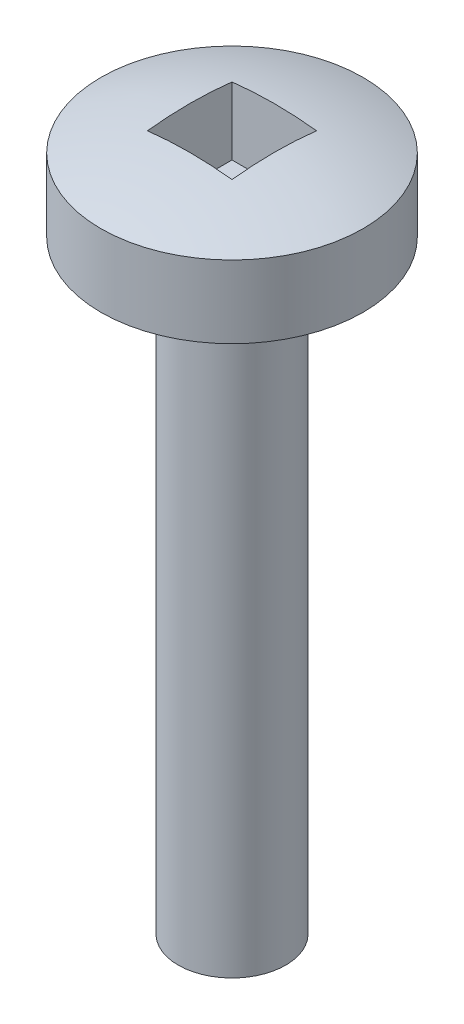
ISO-10303-21;
HEADER;
FILE_DESCRIPTION(('STEP AP214'),'2;1');
FILE_NAME('part.step','',(''),(''),'','','');
FILE_SCHEMA(('AUTOMOTIVE_DESIGN { 1 0 10303 214 1 1 1 1 }'));
ENDSEC;
DATA;
#1=APPLICATION_CONTEXT('core data for automotive mechanical design processes');
#2=APPLICATION_PROTOCOL_DEFINITION('international standard','automotive_design',2000,#1);
#3=PRODUCT_CONTEXT('',#1,'mechanical');
#4=PRODUCT('Part','Part','',(#3));
#5=PRODUCT_RELATED_PRODUCT_CATEGORY('part','',(#4));
#6=PRODUCT_DEFINITION_FORMATION('','',#4);
#7=PRODUCT_DEFINITION_CONTEXT('part definition',#1,'design');
#8=PRODUCT_DEFINITION('design','',#6,#7);
#9=PRODUCT_DEFINITION_SHAPE('','',#8);
#10=(LENGTH_UNIT() NAMED_UNIT(*) SI_UNIT(.MILLI.,.METRE.));
#11=(NAMED_UNIT(*) PLANE_ANGLE_UNIT() SI_UNIT($,.RADIAN.));
#12=(NAMED_UNIT(*) SI_UNIT($,.STERADIAN.) SOLID_ANGLE_UNIT());
#13=UNCERTAINTY_MEASURE_WITH_UNIT(LENGTH_MEASURE(1.E-05),#10,'distance_accuracy_value','');
#14=(GEOMETRIC_REPRESENTATION_CONTEXT(3) GLOBAL_UNCERTAINTY_ASSIGNED_CONTEXT((#13)) GLOBAL_UNIT_ASSIGNED_CONTEXT((#10,
#11,#12)) REPRESENTATION_CONTEXT('',''));
#15=CARTESIAN_POINT('',(0.,0.,0.));
#16=DIRECTION('',(0.,0.,1.));
#17=DIRECTION('',(1.,0.,0.));
#18=AXIS2_PLACEMENT_3D('',#15,#16,#17);
#19=CARTESIAN_POINT('',(0.,-12.7,0.));
#20=DIRECTION('',(0.,1.,0.));
#21=DIRECTION('',(0.,0.,1.));
#22=AXIS2_PLACEMENT_3D('',#19,#20,#21);
#23=CYLINDRICAL_SURFACE('',#22,1.1303);
#24=CARTESIAN_POINT('',(0.,-12.7,0.));
#25=DIRECTION('',(0.,1.,0.));
#26=DIRECTION('',(0.,0.,1.));
#27=AXIS2_PLACEMENT_3D('',#24,#25,#26);
#28=CIRCLE('',#27,1.1303);
#29=CARTESIAN_POINT('',(0.,-12.7,1.1303));
#30=VERTEX_POINT('',#29);
#31=EDGE_CURVE('E104',#30,#30,#28,.T.);
#32=ORIENTED_EDGE('',*,*,#31,.T.);
#33=EDGE_LOOP('',(#32));
#34=FACE_BOUND('',#33,.T.);
#35=CARTESIAN_POINT('',(0.,0.,0.));
#36=DIRECTION('',(0.,1.,0.));
#37=DIRECTION('',(0.,0.,1.));
#38=AXIS2_PLACEMENT_3D('',#35,#36,#37);
#39=CIRCLE('',#38,1.1303);
#40=CARTESIAN_POINT('',(0.,0.,1.1303));
#41=VERTEX_POINT('',#40);
#42=EDGE_CURVE('E108',#41,#41,#39,.T.);
#43=ORIENTED_EDGE('',*,*,#42,.F.);
#44=EDGE_LOOP('',(#43));
#45=FACE_BOUND('',#44,.T.);
#46=ADVANCED_FACE('F32',(#34,#45),#23,.T.);
#47=CARTESIAN_POINT('',(0.,-12.7,0.));
#48=DIRECTION('',(0.,1.,0.));
#49=DIRECTION('',(0.,0.,1.));
#50=AXIS2_PLACEMENT_3D('',#47,#48,#49);
#51=PLANE('',#50);
#52=ORIENTED_EDGE('',*,*,#31,.F.);
#53=EDGE_LOOP('',(#52));
#54=FACE_BOUND('',#53,.T.);
#55=ADVANCED_FACE('F128',(#54),#51,.F.);
#56=CARTESIAN_POINT('',(0.,1.524,0.));
#57=DIRECTION('',(0.,-1.,0.));
#58=DIRECTION('',(0.,0.,-1.));
#59=AXIS2_PLACEMENT_3D('',#56,#57,#58);
#60=CYLINDRICAL_SURFACE('',#59,2.7559);
#61=CARTESIAN_POINT('',(0.,1.524,0.));
#62=DIRECTION('',(0.,1.,0.));
#63=DIRECTION('',(0.,0.,1.));
#64=AXIS2_PLACEMENT_3D('',#61,#62,#63);
#65=CIRCLE('',#64,2.7559);
#66=CARTESIAN_POINT('',(0.,1.524,-2.7559));
#67=VERTEX_POINT('',#66);
#68=EDGE_CURVE('E103',#67,#67,#65,.T.);
#69=CARTESIAN_POINT('',(0.,0.,0.));
#70=DIRECTION('',(0.,1.,0.));
#71=DIRECTION('',(0.,0.,1.));
#72=AXIS2_PLACEMENT_3D('',#69,#70,#71);
#73=CIRCLE('',#72,2.7559);
#74=CARTESIAN_POINT('',(0.,0.,-2.7559));
#75=VERTEX_POINT('',#74);
#76=EDGE_CURVE('E97',#75,#75,#73,.T.);
#77=CARTESIAN_POINT('',(0.,1.524,-2.7559));
#78=CARTESIAN_POINT('',(0.,1.508125,-2.7559));
#79=CARTESIAN_POINT('',(0.,1.49225,-2.7559));
#80=CARTESIAN_POINT('',(0.,1.4605,-2.7559));
#81=CARTESIAN_POINT('',(0.,1.444625,-2.7559));
#82=CARTESIAN_POINT('',(0.,1.412875,-2.7559));
#83=CARTESIAN_POINT('',(0.,1.397,-2.7559));
#84=CARTESIAN_POINT('',(0.,1.36525,-2.7559));
#85=CARTESIAN_POINT('',(0.,1.349375,-2.7559));
#86=CARTESIAN_POINT('',(0.,1.317625,-2.7559));
#87=CARTESIAN_POINT('',(0.,1.30175,-2.7559));
#88=CARTESIAN_POINT('',(0.,1.27,-2.7559));
#89=CARTESIAN_POINT('',(0.,1.254125,-2.7559));
#90=CARTESIAN_POINT('',(0.,1.222375,-2.7559));
#91=CARTESIAN_POINT('',(0.,1.2065,-2.7559));
#92=CARTESIAN_POINT('',(0.,1.17475,-2.7559));
#93=CARTESIAN_POINT('',(0.,1.158875,-2.7559));
#94=CARTESIAN_POINT('',(0.,1.127125,-2.7559));
#95=CARTESIAN_POINT('',(0.,1.11125,-2.7559));
#96=CARTESIAN_POINT('',(0.,1.0795,-2.7559));
#97=CARTESIAN_POINT('',(0.,1.063625,-2.7559));
#98=CARTESIAN_POINT('',(0.,1.031875,-2.7559));
#99=CARTESIAN_POINT('',(0.,1.016,-2.7559));
#100=CARTESIAN_POINT('',(0.,0.98425,-2.7559));
#101=CARTESIAN_POINT('',(0.,0.968375,-2.7559));
#102=CARTESIAN_POINT('',(0.,0.936625,-2.7559));
#103=CARTESIAN_POINT('',(0.,0.92075,-2.7559));
#104=CARTESIAN_POINT('',(0.,0.889,-2.7559));
#105=CARTESIAN_POINT('',(0.,0.873125,-2.7559));
#106=CARTESIAN_POINT('',(0.,0.841375,-2.7559));
#107=CARTESIAN_POINT('',(0.,0.8255,-2.7559));
#108=CARTESIAN_POINT('',(0.,0.79375,-2.7559));
#109=CARTESIAN_POINT('',(0.,0.777875,-2.7559));
#110=CARTESIAN_POINT('',(0.,0.746125,-2.7559));
#111=CARTESIAN_POINT('',(0.,0.73025,-2.7559));
#112=CARTESIAN_POINT('',(0.,0.6985,-2.7559));
#113=CARTESIAN_POINT('',(0.,0.682625,-2.7559));
#114=CARTESIAN_POINT('',(0.,0.650875,-2.7559));
#115=CARTESIAN_POINT('',(0.,0.635,-2.7559));
#116=CARTESIAN_POINT('',(0.,0.60325,-2.7559));
#117=CARTESIAN_POINT('',(0.,0.587375,-2.7559));
#118=CARTESIAN_POINT('',(0.,0.555625,-2.7559));
#119=CARTESIAN_POINT('',(0.,0.53975,-2.7559));
#120=CARTESIAN_POINT('',(0.,0.508,-2.7559));
#121=CARTESIAN_POINT('',(0.,0.492125,-2.7559));
#122=CARTESIAN_POINT('',(0.,0.460375,-2.7559));
#123=CARTESIAN_POINT('',(0.,0.4445,-2.7559));
#124=CARTESIAN_POINT('',(0.,0.41275,-2.7559));
#125=CARTESIAN_POINT('',(0.,0.396875,-2.7559));
#126=CARTESIAN_POINT('',(0.,0.365125,-2.7559));
#127=CARTESIAN_POINT('',(0.,0.34925,-2.7559));
#128=CARTESIAN_POINT('',(0.,0.3175,-2.7559));
#129=CARTESIAN_POINT('',(0.,0.301625,-2.7559));
#130=CARTESIAN_POINT('',(0.,0.269875,-2.7559));
#131=CARTESIAN_POINT('',(0.,0.254,-2.7559));
#132=CARTESIAN_POINT('',(0.,0.22225,-2.7559));
#133=CARTESIAN_POINT('',(0.,0.206375,-2.7559));
#134=CARTESIAN_POINT('',(0.,0.174625,-2.7559));
#135=CARTESIAN_POINT('',(0.,0.15875,-2.7559));
#136=CARTESIAN_POINT('',(0.,0.127,-2.7559));
#137=CARTESIAN_POINT('',(0.,0.111125,-2.7559));
#138=CARTESIAN_POINT('',(0.,0.079375,-2.7559));
#139=CARTESIAN_POINT('',(0.,0.0635,-2.7559));
#140=CARTESIAN_POINT('',(0.,0.0317499999999999,-2.7559));
#141=CARTESIAN_POINT('',(0.,0.015875,-2.7559));
#142=CARTESIAN_POINT('',(0.,0.,-2.7559));
#143=B_SPLINE_CURVE_WITH_KNOTS('',3,(#77,#78,#79,#80,#81,#82,#83,#84,#85,#86,#87,#88,#89,#90,
#91,#92,#93,#94,#95,#96,#97,#98,#99,#100,#101,#102,#103,#104,#105,#106,#107,#108,#109,#110,#111,
#112,#113,#114,#115,#116,#117,#118,#119,#120,#121,#122,#123,#124,#125,#126,#127,#128,#129,#130,
#131,#132,#133,#134,#135,#136,#137,#138,#139,#140,#141,#142),.UNSPECIFIED.,.F.,.F.,(4,2,2,2,2,2,
2,2,2,2,2,2,2,2,2,2,2,2,2,2,2,2,2,2,2,2,2,2,2,2,2,2,4),(0.,0.0476250000000001,
0.0952500000000001,0.142875,0.1905,0.238125,0.28575,0.333375,0.381,0.428625,0.47625,0.523875,
0.5715,0.619125,0.66675,0.714375,0.762,0.809625,0.85725,0.904875,0.9525,1.000125,1.04775,
1.095375,1.143,1.190625,1.23825,1.285875,1.3335,1.381125,1.42875,1.476375,1.524),.UNSPECIFIED.);
#144=EDGE_CURVE('BSEAM123',#67,#75,#143,.T.);
#145=ORIENTED_EDGE('',*,*,#68,.F.);
#146=ORIENTED_EDGE('',*,*,#76,.T.);
#147=ORIENTED_EDGE('',*,*,#144,.T.);
#148=ORIENTED_EDGE('',*,*,#144,.F.);
#149=EDGE_LOOP('',(#145,#147,#146,#148));
#150=FACE_BOUND('',#149,.T.);
#151=ADVANCED_FACE('F123',(#150),#60,.T.);
#152=CARTESIAN_POINT('',(0.,-5.69737875,0.));
#153=DIRECTION('',(0.,0.,1.));
#154=DIRECTION('',(1.,0.,0.));
#155=AXIS2_PLACEMENT_3D('',#152,#153,#154);
#156=SPHERICAL_SURFACE('',#155,7.72937875);
#157=CARTESIAN_POINT('',(0.889,-5.69737875,0.));
#158=DIRECTION('',(1.,0.,0.));
#159=DIRECTION('',(0.,0.,-1.));
#160=AXIS2_PLACEMENT_3D('',#157,#158,#159);
#161=CIRCLE('',#160,7.67808406185759);
#162=CARTESIAN_POINT('',(0.889,1.92906562867028,0.889));
#163=VERTEX_POINT('',#162);
#164=CARTESIAN_POINT('',(0.889,1.92906562867028,-0.889));
#165=VERTEX_POINT('',#164);
#166=EDGE_CURVE('E11',#163,#165,#161,.F.);
#167=ORIENTED_EDGE('',*,*,#166,.F.);
#168=CARTESIAN_POINT('',(0.,-5.69737875,0.889));
#169=DIRECTION('',(0.,0.,1.));
#170=DIRECTION('',(1.,0.,0.));
#171=AXIS2_PLACEMENT_3D('',#168,#169,#170);
#172=CIRCLE('',#171,7.67808406185759);
#173=CARTESIAN_POINT('',(-0.889,1.92906562867028,0.888999999999999));
#174=VERTEX_POINT('',#173);
#175=EDGE_CURVE('E40',#174,#163,#172,.F.);
#176=ORIENTED_EDGE('',*,*,#175,.F.);
#177=CARTESIAN_POINT('',(-0.889,-5.69737875,0.));
#178=DIRECTION('',(-1.,0.,0.));
#179=DIRECTION('',(0.,0.,1.));
#180=AXIS2_PLACEMENT_3D('',#177,#178,#179);
#181=CIRCLE('',#180,7.67808406185759);
#182=CARTESIAN_POINT('',(-0.888999999999999,1.92906562867028,-0.889));
#183=VERTEX_POINT('',#182);
#184=EDGE_CURVE('E114',#183,#174,#181,.F.);
#185=ORIENTED_EDGE('',*,*,#184,.F.);
#186=CARTESIAN_POINT('',(0.,-5.69737875,-0.889));
#187=DIRECTION('',(0.,0.,-1.));
#188=DIRECTION('',(-1.,0.,0.));
#189=AXIS2_PLACEMENT_3D('',#186,#187,#188);
#190=CIRCLE('',#189,7.67808406185759);
#191=EDGE_CURVE('E107',#165,#183,#190,.F.);
#192=ORIENTED_EDGE('',*,*,#191,.F.);
#193=EDGE_LOOP('',(#167,#176,#185,#192));
#194=FACE_BOUND('',#193,.T.);
#195=ORIENTED_EDGE('',*,*,#68,.T.);
#196=EDGE_LOOP('',(#195));
#197=FACE_BOUND('',#196,.T.);
#198=ADVANCED_FACE('F34',(#194,#197),#156,.T.);
#199=CARTESIAN_POINT('',(0.,0.,0.));
#200=DIRECTION('',(0.,1.,0.));
#201=DIRECTION('',(0.,0.,1.));
#202=AXIS2_PLACEMENT_3D('',#199,#200,#201);
#203=PLANE('',#202);
#204=ORIENTED_EDGE('',*,*,#42,.T.);
#205=EDGE_LOOP('',(#204));
#206=FACE_BOUND('',#205,.T.);
#207=ORIENTED_EDGE('',*,*,#76,.F.);
#208=EDGE_LOOP('',(#207));
#209=FACE_BOUND('',#208,.T.);
#210=ADVANCED_FACE('F122',(#206,#209),#203,.F.);
#211=CARTESIAN_POINT('',(0.889,0.508,0.889));
#212=DIRECTION('',(1.,0.,0.));
#213=DIRECTION('',(0.,0.,-1.));
#214=AXIS2_PLACEMENT_3D('',#211,#212,#213);
#215=PLANE('',#214);
#216=ORIENTED_EDGE('',*,*,#166,.T.);
#217=DIRECTION('',(0.,1.,0.));
#218=VECTOR('',#217,1.);
#219=CARTESIAN_POINT('',(0.889,0.508,-0.889));
#220=LINE('',#219,#218);
#221=CARTESIAN_POINT('',(0.889,0.508,-0.889));
#222=VERTEX_POINT('',#221);
#223=EDGE_CURVE('E47',#222,#165,#220,.T.);
#224=ORIENTED_EDGE('',*,*,#223,.F.);
#225=DIRECTION('',(0.,0.,-1.));
#226=VECTOR('',#225,1.);
#227=CARTESIAN_POINT('',(0.889,0.508,0.889));
#228=LINE('',#227,#226);
#229=CARTESIAN_POINT('',(0.889,0.508,0.889));
#230=VERTEX_POINT('',#229);
#231=EDGE_CURVE('E73',#230,#222,#228,.T.);
#232=ORIENTED_EDGE('',*,*,#231,.F.);
#233=DIRECTION('',(0.,1.,0.));
#234=VECTOR('',#233,1.);
#235=CARTESIAN_POINT('',(0.889,0.508,0.889));
#236=LINE('',#235,#234);
#237=EDGE_CURVE('E95',#230,#163,#236,.T.);
#238=ORIENTED_EDGE('',*,*,#237,.T.);
#239=EDGE_LOOP('',(#216,#224,#232,#238));
#240=FACE_BOUND('',#239,.T.);
#241=ADVANCED_FACE('F71',(#240),#215,.F.);
#242=CARTESIAN_POINT('',(-0.889,0.508,0.889));
#243=DIRECTION('',(0.,0.,1.));
#244=DIRECTION('',(1.,0.,0.));
#245=AXIS2_PLACEMENT_3D('',#242,#243,#244);
#246=PLANE('',#245);
#247=ORIENTED_EDGE('',*,*,#175,.T.);
#248=ORIENTED_EDGE('',*,*,#237,.F.);
#249=DIRECTION('',(1.,0.,0.));
#250=VECTOR('',#249,1.);
#251=CARTESIAN_POINT('',(-0.889,0.508,0.889));
#252=LINE('',#251,#250);
#253=CARTESIAN_POINT('',(-0.889,0.508,0.889));
#254=VERTEX_POINT('',#253);
#255=EDGE_CURVE('E78',#254,#230,#252,.T.);
#256=ORIENTED_EDGE('',*,*,#255,.F.);
#257=DIRECTION('',(0.,1.,0.));
#258=VECTOR('',#257,1.);
#259=CARTESIAN_POINT('',(-0.889,0.508,0.889));
#260=LINE('',#259,#258);
#261=EDGE_CURVE('E98',#254,#174,#260,.T.);
#262=ORIENTED_EDGE('',*,*,#261,.T.);
#263=EDGE_LOOP('',(#247,#248,#256,#262));
#264=FACE_BOUND('',#263,.T.);
#265=ADVANCED_FACE('F119',(#264),#246,.F.);
#266=CARTESIAN_POINT('',(-0.889,0.508,0.889));
#267=DIRECTION('',(-1.,0.,0.));
#268=DIRECTION('',(0.,0.,1.));
#269=AXIS2_PLACEMENT_3D('',#266,#267,#268);
#270=PLANE('',#269);
#271=ORIENTED_EDGE('',*,*,#184,.T.);
#272=ORIENTED_EDGE('',*,*,#261,.F.);
#273=DIRECTION('',(0.,0.,1.));
#274=VECTOR('',#273,1.);
#275=CARTESIAN_POINT('',(-0.889,0.508,0.889));
#276=LINE('',#275,#274);
#277=CARTESIAN_POINT('',(-0.889,0.508,-0.889));
#278=VERTEX_POINT('',#277);
#279=EDGE_CURVE('E87',#278,#254,#276,.T.);
#280=ORIENTED_EDGE('',*,*,#279,.F.);
#281=DIRECTION('',(0.,1.,0.));
#282=VECTOR('',#281,1.);
#283=CARTESIAN_POINT('',(-0.889,0.508,-0.889));
#284=LINE('',#283,#282);
#285=EDGE_CURVE('E77',#278,#183,#284,.T.);
#286=ORIENTED_EDGE('',*,*,#285,.T.);
#287=EDGE_LOOP('',(#271,#272,#280,#286));
#288=FACE_BOUND('',#287,.T.);
#289=ADVANCED_FACE('F117',(#288),#270,.F.);
#290=CARTESIAN_POINT('',(-0.889,0.508,-0.889));
#291=DIRECTION('',(0.,0.,-1.));
#292=DIRECTION('',(-1.,0.,0.));
#293=AXIS2_PLACEMENT_3D('',#290,#291,#292);
#294=PLANE('',#293);
#295=ORIENTED_EDGE('',*,*,#191,.T.);
#296=ORIENTED_EDGE('',*,*,#285,.F.);
#297=DIRECTION('',(-1.,0.,0.));
#298=VECTOR('',#297,1.);
#299=CARTESIAN_POINT('',(-0.889,0.508,-0.889));
#300=LINE('',#299,#298);
#301=EDGE_CURVE('E81',#222,#278,#300,.T.);
#302=ORIENTED_EDGE('',*,*,#301,.F.);
#303=ORIENTED_EDGE('',*,*,#223,.T.);
#304=EDGE_LOOP('',(#295,#296,#302,#303));
#305=FACE_BOUND('',#304,.T.);
#306=ADVANCED_FACE('F82',(#305),#294,.F.);
#307=CARTESIAN_POINT('',(0.,0.508,0.));
#308=DIRECTION('',(0.,-1.,0.));
#309=DIRECTION('',(0.,0.,-1.));
#310=AXIS2_PLACEMENT_3D('',#307,#308,#309);
#311=PLANE('',#310);
#312=ORIENTED_EDGE('',*,*,#231,.T.);
#313=ORIENTED_EDGE('',*,*,#301,.T.);
#314=ORIENTED_EDGE('',*,*,#279,.T.);
#315=ORIENTED_EDGE('',*,*,#255,.T.);
#316=EDGE_LOOP('',(#312,#313,#314,#315));
#317=FACE_BOUND('',#316,.T.);
#318=ADVANCED_FACE('F89',(#317),#311,.F.);
#319=CLOSED_SHELL('',(#46,#55,#151,#198,#210,#241,#265,#289,#306,#318));
#320=MANIFOLD_SOLID_BREP('B2',#319);
#321=ADVANCED_BREP_SHAPE_REPRESENTATION('',(#18,#320),#14);
#322=SHAPE_DEFINITION_REPRESENTATION(#9,#321);
ENDSEC;
END-ISO-10303-21;
